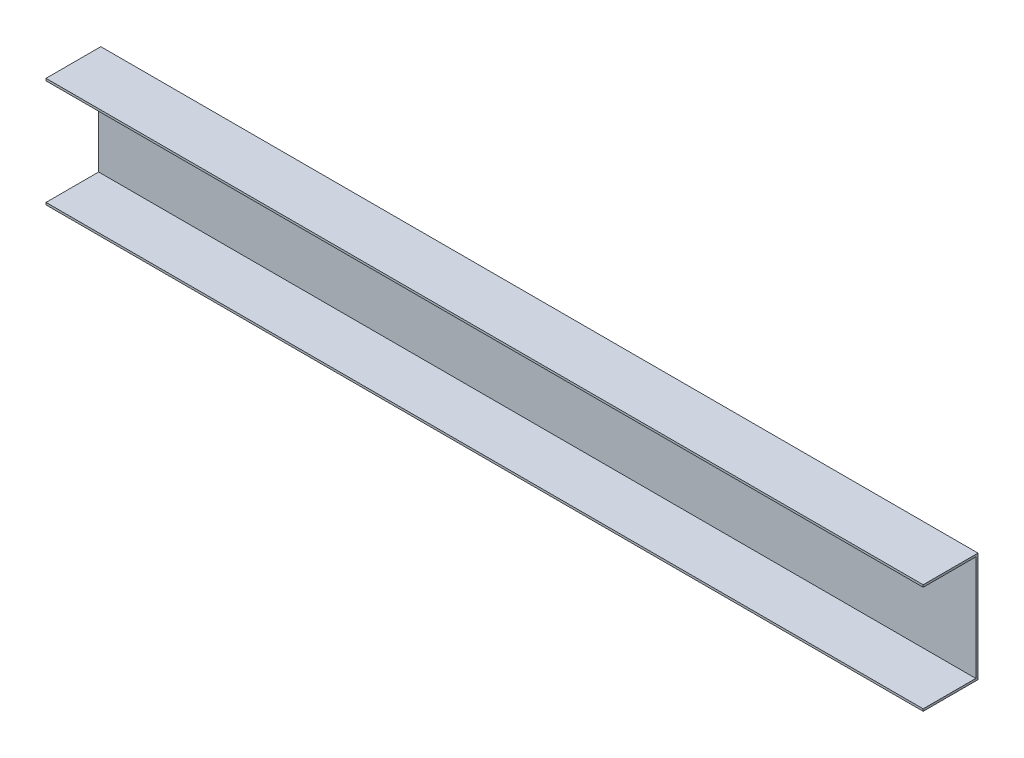
ISO-10303-21;
HEADER;
FILE_DESCRIPTION(('STEP AP214'),'2;1');
FILE_NAME('part.step','',(''),(''),'','','');
FILE_SCHEMA(('AUTOMOTIVE_DESIGN { 1 0 10303 214 1 1 1 1 }'));
ENDSEC;
DATA;
#1=APPLICATION_CONTEXT('core data for automotive mechanical design processes');
#2=APPLICATION_PROTOCOL_DEFINITION('international standard','automotive_design',2000,#1);
#3=PRODUCT_CONTEXT('',#1,'mechanical');
#4=PRODUCT('Part','Part','',(#3));
#5=PRODUCT_RELATED_PRODUCT_CATEGORY('part','',(#4));
#6=PRODUCT_DEFINITION_FORMATION('','',#4);
#7=PRODUCT_DEFINITION_CONTEXT('part definition',#1,'design');
#8=PRODUCT_DEFINITION('design','',#6,#7);
#9=PRODUCT_DEFINITION_SHAPE('','',#8);
#10=(LENGTH_UNIT() NAMED_UNIT(*) SI_UNIT(.MILLI.,.METRE.));
#11=(NAMED_UNIT(*) PLANE_ANGLE_UNIT() SI_UNIT($,.RADIAN.));
#12=(NAMED_UNIT(*) SI_UNIT($,.STERADIAN.) SOLID_ANGLE_UNIT());
#13=UNCERTAINTY_MEASURE_WITH_UNIT(LENGTH_MEASURE(1.E-05),#10,'distance_accuracy_value','');
#14=(GEOMETRIC_REPRESENTATION_CONTEXT(3) GLOBAL_UNCERTAINTY_ASSIGNED_CONTEXT((#13)) GLOBAL_UNIT_ASSIGNED_CONTEXT((#10,
#11,#12)) REPRESENTATION_CONTEXT('',''));
#15=CARTESIAN_POINT('',(0.,0.,0.));
#16=DIRECTION('',(0.,0.,1.));
#17=DIRECTION('',(1.,0.,0.));
#18=AXIS2_PLACEMENT_3D('',#15,#16,#17);
#19=CARTESIAN_POINT('',(800.,50.,0.));
#20=DIRECTION('',(0.,-1.,0.));
#21=DIRECTION('',(0.,0.,-1.));
#22=AXIS2_PLACEMENT_3D('',#19,#20,#21);
#23=PLANE('',#22);
#24=DIRECTION('',(0.,0.,1.));
#25=VECTOR('',#24,1.);
#26=CARTESIAN_POINT('',(0.,50.,0.));
#27=LINE('',#26,#25);
#28=CARTESIAN_POINT('',(0.,50.,0.));
#29=VERTEX_POINT('',#28);
#30=CARTESIAN_POINT('',(0.,50.,50.));
#31=VERTEX_POINT('',#30);
#32=EDGE_CURVE('E138',#29,#31,#27,.T.);
#33=ORIENTED_EDGE('',*,*,#32,.T.);
#34=DIRECTION('',(-1.,0.,0.));
#35=VECTOR('',#34,1.);
#36=CARTESIAN_POINT('',(800.,50.,50.));
#37=LINE('',#36,#35);
#38=CARTESIAN_POINT('',(800.,50.,50.));
#39=VERTEX_POINT('',#38);
#40=EDGE_CURVE('E11',#39,#31,#37,.T.);
#41=ORIENTED_EDGE('',*,*,#40,.F.);
#42=DIRECTION('',(0.,0.,1.));
#43=VECTOR('',#42,1.);
#44=CARTESIAN_POINT('',(800.,50.,0.));
#45=LINE('',#44,#43);
#46=CARTESIAN_POINT('',(800.,50.,0.));
#47=VERTEX_POINT('',#46);
#48=EDGE_CURVE('E96',#47,#39,#45,.T.);
#49=ORIENTED_EDGE('',*,*,#48,.F.);
#50=DIRECTION('',(-1.,0.,0.));
#51=VECTOR('',#50,1.);
#52=CARTESIAN_POINT('',(800.,50.,0.));
#53=LINE('',#52,#51);
#54=EDGE_CURVE('E137',#47,#29,#53,.T.);
#55=ORIENTED_EDGE('',*,*,#54,.T.);
#56=EDGE_LOOP('',(#33,#41,#49,#55));
#57=FACE_BOUND('',#56,.T.);
#58=ADVANCED_FACE('F41',(#57),#23,.F.);
#59=CARTESIAN_POINT('',(800.,48.,50.));
#60=DIRECTION('',(0.,0.,1.));
#61=DIRECTION('',(1.,0.,0.));
#62=AXIS2_PLACEMENT_3D('',#59,#60,#61);
#63=PLANE('',#62);
#64=DIRECTION('',(0.,1.,0.));
#65=VECTOR('',#64,1.);
#66=CARTESIAN_POINT('',(0.,48.,50.));
#67=LINE('',#66,#65);
#68=CARTESIAN_POINT('',(0.,48.,50.));
#69=VERTEX_POINT('',#68);
#70=EDGE_CURVE('E141',#69,#31,#67,.T.);
#71=ORIENTED_EDGE('',*,*,#70,.F.);
#72=DIRECTION('',(-1.,0.,0.));
#73=VECTOR('',#72,1.);
#74=CARTESIAN_POINT('',(800.,48.,50.));
#75=LINE('',#74,#73);
#76=CARTESIAN_POINT('',(800.,48.,50.));
#77=VERTEX_POINT('',#76);
#78=EDGE_CURVE('E49',#77,#69,#75,.T.);
#79=ORIENTED_EDGE('',*,*,#78,.F.);
#80=DIRECTION('',(0.,1.,0.));
#81=VECTOR('',#80,1.);
#82=CARTESIAN_POINT('',(800.,48.,50.));
#83=LINE('',#82,#81);
#84=EDGE_CURVE('E180',#77,#39,#83,.T.);
#85=ORIENTED_EDGE('',*,*,#84,.T.);
#86=ORIENTED_EDGE('',*,*,#40,.T.);
#87=EDGE_LOOP('',(#71,#79,#85,#86));
#88=FACE_BOUND('',#87,.T.);
#89=ADVANCED_FACE('F171',(#88),#63,.T.);
#90=CARTESIAN_POINT('',(800.,48.,0.));
#91=DIRECTION('',(0.,-1.,0.));
#92=DIRECTION('',(0.,0.,-1.));
#93=AXIS2_PLACEMENT_3D('',#90,#91,#92);
#94=PLANE('',#93);
#95=DIRECTION('',(0.,0.,1.));
#96=VECTOR('',#95,1.);
#97=CARTESIAN_POINT('',(0.,48.,0.));
#98=LINE('',#97,#96);
#99=CARTESIAN_POINT('',(0.,48.,2.00000000000002));
#100=VERTEX_POINT('',#99);
#101=EDGE_CURVE('E144',#100,#69,#98,.T.);
#102=ORIENTED_EDGE('',*,*,#101,.F.);
#103=DIRECTION('',(-1.,0.,0.));
#104=VECTOR('',#103,1.);
#105=CARTESIAN_POINT('',(800.,48.,2.00000000000002));
#106=LINE('',#105,#104);
#107=CARTESIAN_POINT('',(800.,48.,2.00000000000002));
#108=VERTEX_POINT('',#107);
#109=EDGE_CURVE('E161',#108,#100,#106,.T.);
#110=ORIENTED_EDGE('',*,*,#109,.F.);
#111=DIRECTION('',(0.,0.,1.));
#112=VECTOR('',#111,1.);
#113=CARTESIAN_POINT('',(800.,48.,0.));
#114=LINE('',#113,#112);
#115=EDGE_CURVE('E168',#108,#77,#114,.T.);
#116=ORIENTED_EDGE('',*,*,#115,.T.);
#117=ORIENTED_EDGE('',*,*,#78,.T.);
#118=EDGE_LOOP('',(#102,#110,#116,#117));
#119=FACE_BOUND('',#118,.T.);
#120=ADVANCED_FACE('F166',(#119),#94,.T.);
#121=CARTESIAN_POINT('',(800.,-50.,2.));
#122=DIRECTION('',(0.,0.,1.));
#123=DIRECTION('',(0.,-1.,0.));
#124=AXIS2_PLACEMENT_3D('',#121,#122,#123);
#125=PLANE('',#124);
#126=DIRECTION('',(0.,1.,0.));
#127=VECTOR('',#126,1.);
#128=CARTESIAN_POINT('',(0.,-50.,2.));
#129=LINE('',#128,#127);
#130=CARTESIAN_POINT('',(0.,-48.,2.));
#131=VERTEX_POINT('',#130);
#132=EDGE_CURVE('E147',#131,#100,#129,.T.);
#133=ORIENTED_EDGE('',*,*,#132,.F.);
#134=DIRECTION('',(-1.,0.,0.));
#135=VECTOR('',#134,1.);
#136=CARTESIAN_POINT('',(800.,-48.,2.));
#137=LINE('',#136,#135);
#138=CARTESIAN_POINT('',(800.,-48.,2.));
#139=VERTEX_POINT('',#138);
#140=EDGE_CURVE('E159',#139,#131,#137,.T.);
#141=ORIENTED_EDGE('',*,*,#140,.F.);
#142=DIRECTION('',(0.,1.,0.));
#143=VECTOR('',#142,1.);
#144=CARTESIAN_POINT('',(800.,-50.,2.));
#145=LINE('',#144,#143);
#146=EDGE_CURVE('E132',#139,#108,#145,.T.);
#147=ORIENTED_EDGE('',*,*,#146,.T.);
#148=ORIENTED_EDGE('',*,*,#109,.T.);
#149=EDGE_LOOP('',(#133,#141,#147,#148));
#150=FACE_BOUND('',#149,.T.);
#151=ADVANCED_FACE('F178',(#150),#125,.T.);
#152=CARTESIAN_POINT('',(800.,-48.,0.));
#153=DIRECTION('',(0.,1.,0.));
#154=DIRECTION('',(0.,0.,1.));
#155=AXIS2_PLACEMENT_3D('',#152,#153,#154);
#156=PLANE('',#155);
#157=DIRECTION('',(0.,0.,-1.));
#158=VECTOR('',#157,1.);
#159=CARTESIAN_POINT('',(0.,-48.,0.));
#160=LINE('',#159,#158);
#161=CARTESIAN_POINT('',(0.,-48.,50.));
#162=VERTEX_POINT('',#161);
#163=EDGE_CURVE('E150',#162,#131,#160,.T.);
#164=ORIENTED_EDGE('',*,*,#163,.F.);
#165=DIRECTION('',(-1.,0.,0.));
#166=VECTOR('',#165,1.);
#167=CARTESIAN_POINT('',(800.,-48.,50.));
#168=LINE('',#167,#166);
#169=CARTESIAN_POINT('',(800.,-48.,50.));
#170=VERTEX_POINT('',#169);
#171=EDGE_CURVE('E120',#170,#162,#168,.T.);
#172=ORIENTED_EDGE('',*,*,#171,.F.);
#173=DIRECTION('',(0.,0.,-1.));
#174=VECTOR('',#173,1.);
#175=CARTESIAN_POINT('',(800.,-48.,0.));
#176=LINE('',#175,#174);
#177=EDGE_CURVE('E130',#170,#139,#176,.T.);
#178=ORIENTED_EDGE('',*,*,#177,.T.);
#179=ORIENTED_EDGE('',*,*,#140,.T.);
#180=EDGE_LOOP('',(#164,#172,#178,#179));
#181=FACE_BOUND('',#180,.T.);
#182=ADVANCED_FACE('F185',(#181),#156,.T.);
#183=CARTESIAN_POINT('',(800.,-50.,50.));
#184=DIRECTION('',(0.,0.,1.));
#185=DIRECTION('',(1.,0.,0.));
#186=AXIS2_PLACEMENT_3D('',#183,#184,#185);
#187=PLANE('',#186);
#188=DIRECTION('',(0.,1.,0.));
#189=VECTOR('',#188,1.);
#190=CARTESIAN_POINT('',(0.,-50.,50.));
#191=LINE('',#190,#189);
#192=CARTESIAN_POINT('',(0.,-50.,50.));
#193=VERTEX_POINT('',#192);
#194=EDGE_CURVE('E119',#193,#162,#191,.T.);
#195=ORIENTED_EDGE('',*,*,#194,.F.);
#196=DIRECTION('',(-1.,0.,0.));
#197=VECTOR('',#196,1.);
#198=CARTESIAN_POINT('',(800.,-50.,50.));
#199=LINE('',#198,#197);
#200=CARTESIAN_POINT('',(800.,-50.,50.));
#201=VERTEX_POINT('',#200);
#202=EDGE_CURVE('E113',#201,#193,#199,.T.);
#203=ORIENTED_EDGE('',*,*,#202,.F.);
#204=DIRECTION('',(0.,1.,0.));
#205=VECTOR('',#204,1.);
#206=CARTESIAN_POINT('',(800.,-50.,50.));
#207=LINE('',#206,#205);
#208=EDGE_CURVE('E117',#201,#170,#207,.T.);
#209=ORIENTED_EDGE('',*,*,#208,.T.);
#210=ORIENTED_EDGE('',*,*,#171,.T.);
#211=EDGE_LOOP('',(#195,#203,#209,#210));
#212=FACE_BOUND('',#211,.T.);
#213=ADVANCED_FACE('F115',(#212),#187,.T.);
#214=CARTESIAN_POINT('',(800.,-50.,0.));
#215=DIRECTION('',(0.,1.,0.));
#216=DIRECTION('',(0.,0.,1.));
#217=AXIS2_PLACEMENT_3D('',#214,#215,#216);
#218=PLANE('',#217);
#219=DIRECTION('',(0.,0.,-1.));
#220=VECTOR('',#219,1.);
#221=CARTESIAN_POINT('',(0.,-50.,0.));
#222=LINE('',#221,#220);
#223=CARTESIAN_POINT('',(0.,-50.,0.));
#224=VERTEX_POINT('',#223);
#225=EDGE_CURVE('E84',#193,#224,#222,.T.);
#226=ORIENTED_EDGE('',*,*,#225,.T.);
#227=DIRECTION('',(-1.,0.,0.));
#228=VECTOR('',#227,1.);
#229=CARTESIAN_POINT('',(800.,-50.,0.));
#230=LINE('',#229,#228);
#231=CARTESIAN_POINT('',(800.,-50.,0.));
#232=VERTEX_POINT('',#231);
#233=EDGE_CURVE('E121',#232,#224,#230,.T.);
#234=ORIENTED_EDGE('',*,*,#233,.F.);
#235=DIRECTION('',(0.,0.,-1.));
#236=VECTOR('',#235,1.);
#237=CARTESIAN_POINT('',(800.,-50.,0.));
#238=LINE('',#237,#236);
#239=EDGE_CURVE('E123',#201,#232,#238,.T.);
#240=ORIENTED_EDGE('',*,*,#239,.F.);
#241=ORIENTED_EDGE('',*,*,#202,.T.);
#242=EDGE_LOOP('',(#226,#234,#240,#241));
#243=FACE_BOUND('',#242,.T.);
#244=ADVANCED_FACE('F124',(#243),#218,.F.);
#245=CARTESIAN_POINT('',(800.,-50.,0.));
#246=DIRECTION('',(0.,0.,1.));
#247=DIRECTION('',(0.,-1.,0.));
#248=AXIS2_PLACEMENT_3D('',#245,#246,#247);
#249=PLANE('',#248);
#250=DIRECTION('',(0.,1.,0.));
#251=VECTOR('',#250,1.);
#252=CARTESIAN_POINT('',(0.,-50.,0.));
#253=LINE('',#252,#251);
#254=EDGE_CURVE('E90',#224,#29,#253,.T.);
#255=ORIENTED_EDGE('',*,*,#254,.T.);
#256=ORIENTED_EDGE('',*,*,#54,.F.);
#257=DIRECTION('',(0.,1.,0.));
#258=VECTOR('',#257,1.);
#259=CARTESIAN_POINT('',(800.,-50.,0.));
#260=LINE('',#259,#258);
#261=EDGE_CURVE('E57',#232,#47,#260,.T.);
#262=ORIENTED_EDGE('',*,*,#261,.F.);
#263=ORIENTED_EDGE('',*,*,#233,.T.);
#264=EDGE_LOOP('',(#255,#256,#262,#263));
#265=FACE_BOUND('',#264,.T.);
#266=ADVANCED_FACE('F187',(#265),#249,.F.);
#267=CARTESIAN_POINT('',(800.,0.,0.));
#268=DIRECTION('',(-1.,0.,0.));
#269=DIRECTION('',(0.,0.,1.));
#270=AXIS2_PLACEMENT_3D('',#267,#268,#269);
#271=PLANE('',#270);
#272=ORIENTED_EDGE('',*,*,#48,.T.);
#273=ORIENTED_EDGE('',*,*,#84,.F.);
#274=ORIENTED_EDGE('',*,*,#115,.F.);
#275=ORIENTED_EDGE('',*,*,#146,.F.);
#276=ORIENTED_EDGE('',*,*,#177,.F.);
#277=ORIENTED_EDGE('',*,*,#208,.F.);
#278=ORIENTED_EDGE('',*,*,#239,.T.);
#279=ORIENTED_EDGE('',*,*,#261,.T.);
#280=EDGE_LOOP('',(#272,#273,#274,#275,#276,#277,#278,#279));
#281=FACE_BOUND('',#280,.T.);
#282=ADVANCED_FACE('F127',(#281),#271,.F.);
#283=CARTESIAN_POINT('',(0.,0.,0.));
#284=DIRECTION('',(-1.,0.,0.));
#285=DIRECTION('',(0.,0.,1.));
#286=AXIS2_PLACEMENT_3D('',#283,#284,#285);
#287=PLANE('',#286);
#288=ORIENTED_EDGE('',*,*,#32,.F.);
#289=ORIENTED_EDGE('',*,*,#254,.F.);
#290=ORIENTED_EDGE('',*,*,#225,.F.);
#291=ORIENTED_EDGE('',*,*,#194,.T.);
#292=ORIENTED_EDGE('',*,*,#163,.T.);
#293=ORIENTED_EDGE('',*,*,#132,.T.);
#294=ORIENTED_EDGE('',*,*,#101,.T.);
#295=ORIENTED_EDGE('',*,*,#70,.T.);
#296=EDGE_LOOP('',(#288,#289,#290,#291,#292,#293,#294,#295));
#297=FACE_BOUND('',#296,.T.);
#298=ADVANCED_FACE('F174',(#297),#287,.T.);
#299=CLOSED_SHELL('',(#58,#89,#120,#151,#182,#213,#244,#266,#282,#298));
#300=MANIFOLD_SOLID_BREP('B2',#299);
#301=ADVANCED_BREP_SHAPE_REPRESENTATION('',(#18,#300),#14);
#302=SHAPE_DEFINITION_REPRESENTATION(#9,#301);
ENDSEC;
END-ISO-10303-21;
